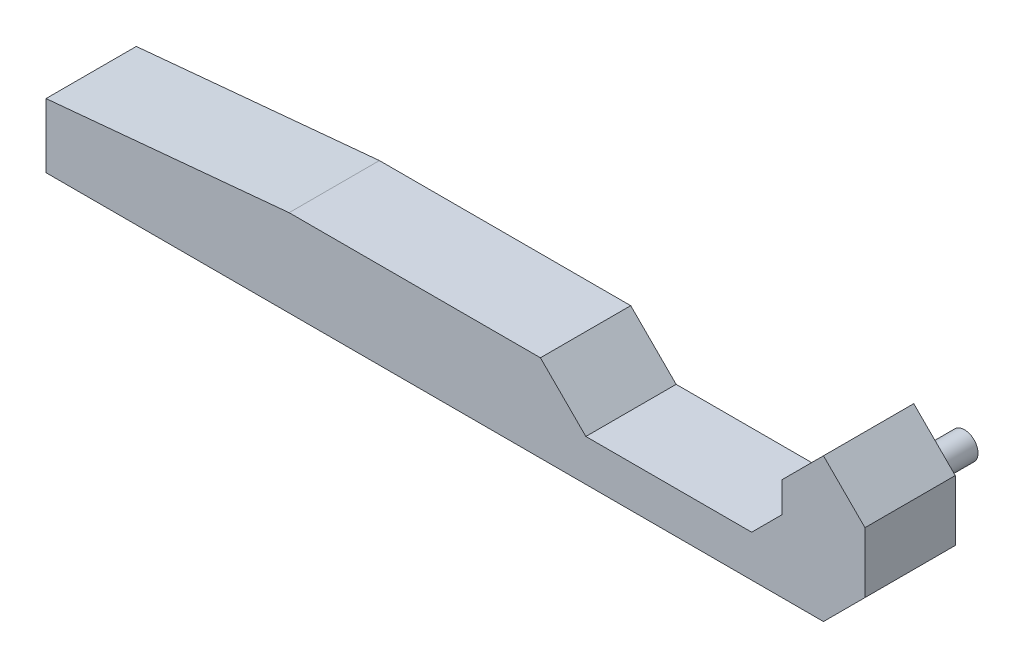
ISO-10303-21;
HEADER;
FILE_DESCRIPTION(('STEP AP214'),'2;1');
FILE_NAME('part.step','',(''),(''),'','','');
FILE_SCHEMA(('AUTOMOTIVE_DESIGN { 1 0 10303 214 1 1 1 1 }'));
ENDSEC;
DATA;
#1=APPLICATION_CONTEXT('core data for automotive mechanical design processes');
#2=APPLICATION_PROTOCOL_DEFINITION('international standard','automotive_design',2000,#1);
#3=PRODUCT_CONTEXT('',#1,'mechanical');
#4=PRODUCT('Part','Part','',(#3));
#5=PRODUCT_RELATED_PRODUCT_CATEGORY('part','',(#4));
#6=PRODUCT_DEFINITION_FORMATION('','',#4);
#7=PRODUCT_DEFINITION_CONTEXT('part definition',#1,'design');
#8=PRODUCT_DEFINITION('design','',#6,#7);
#9=PRODUCT_DEFINITION_SHAPE('','',#8);
#10=(LENGTH_UNIT() NAMED_UNIT(*) SI_UNIT(.MILLI.,.METRE.));
#11=(NAMED_UNIT(*) PLANE_ANGLE_UNIT() SI_UNIT($,.RADIAN.));
#12=(NAMED_UNIT(*) SI_UNIT($,.STERADIAN.) SOLID_ANGLE_UNIT());
#13=UNCERTAINTY_MEASURE_WITH_UNIT(LENGTH_MEASURE(1.E-05),#10,'distance_accuracy_value','');
#14=(GEOMETRIC_REPRESENTATION_CONTEXT(3) GLOBAL_UNCERTAINTY_ASSIGNED_CONTEXT((#13)) GLOBAL_UNIT_ASSIGNED_CONTEXT((#10,
#11,#12)) REPRESENTATION_CONTEXT('',''));
#15=CARTESIAN_POINT('',(0.,0.,0.));
#16=DIRECTION('',(0.,0.,1.));
#17=DIRECTION('',(1.,0.,0.));
#18=AXIS2_PLACEMENT_3D('',#15,#16,#17);
#19=CARTESIAN_POINT('',(0.,0.,10.));
#20=DIRECTION('',(-0.707106781186548,-0.707106781186548,0.));
#21=DIRECTION('',(0.707106781186548,-0.707106781186548,0.));
#22=AXIS2_PLACEMENT_3D('',#19,#20,#21);
#23=PLANE('',#22);
#24=DIRECTION('',(-0.707106781186547,0.707106781186547,0.));
#25=VECTOR('',#24,1.);
#26=CARTESIAN_POINT('',(0.,0.,0.));
#27=LINE('',#26,#25);
#28=CARTESIAN_POINT('',(0.,0.,0.));
#29=VERTEX_POINT('',#28);
#30=CARTESIAN_POINT('',(-4.59728123929288,4.59728123929288,0.));
#31=VERTEX_POINT('',#30);
#32=EDGE_CURVE('E153',#29,#31,#27,.T.);
#33=ORIENTED_EDGE('',*,*,#32,.T.);
#34=DIRECTION('',(0.,0.,-1.));
#35=VECTOR('',#34,1.);
#36=CARTESIAN_POINT('',(-4.59728123929288,4.59728123929288,10.));
#37=LINE('',#36,#35);
#38=CARTESIAN_POINT('',(-4.59728123929288,4.59728123929288,10.));
#39=VERTEX_POINT('',#38);
#40=EDGE_CURVE('E41',#39,#31,#37,.T.);
#41=ORIENTED_EDGE('',*,*,#40,.F.);
#42=DIRECTION('',(-0.707106781186547,0.707106781186547,0.));
#43=VECTOR('',#42,1.);
#44=CARTESIAN_POINT('',(0.,0.,10.));
#45=LINE('',#44,#43);
#46=CARTESIAN_POINT('',(0.,0.,10.));
#47=VERTEX_POINT('',#46);
#48=EDGE_CURVE('E178',#47,#39,#45,.T.);
#49=ORIENTED_EDGE('',*,*,#48,.F.);
#50=DIRECTION('',(0.,0.,-1.));
#51=VECTOR('',#50,1.);
#52=CARTESIAN_POINT('',(0.,0.,10.));
#53=LINE('',#52,#51);
#54=EDGE_CURVE('E149',#47,#29,#53,.T.);
#55=ORIENTED_EDGE('',*,*,#54,.T.);
#56=EDGE_LOOP('',(#33,#41,#49,#55));
#57=FACE_BOUND('',#56,.T.);
#58=ADVANCED_FACE('F33',(#57),#23,.F.);
#59=CARTESIAN_POINT('',(-4.59728123929288,4.59728123929288,10.));
#60=DIRECTION('',(0.707106781186548,-0.707106781186548,0.));
#61=DIRECTION('',(0.707106781186548,0.707106781186548,0.));
#62=AXIS2_PLACEMENT_3D('',#59,#60,#61);
#63=PLANE('',#62);
#64=DIRECTION('',(-0.707106781186547,-0.707106781186547,0.));
#65=VECTOR('',#64,1.);
#66=CARTESIAN_POINT('',(-4.59728123929288,4.59728123929288,0.));
#67=LINE('',#66,#65);
#68=CARTESIAN_POINT('',(-9.19456247858576,0.,0.));
#69=VERTEX_POINT('',#68);
#70=EDGE_CURVE('E156',#31,#69,#67,.T.);
#71=ORIENTED_EDGE('',*,*,#70,.T.);
#72=DIRECTION('',(0.,0.,-1.));
#73=VECTOR('',#72,1.);
#74=CARTESIAN_POINT('',(-9.19456247858576,0.,10.));
#75=LINE('',#74,#73);
#76=CARTESIAN_POINT('',(-9.19456247858576,0.,10.));
#77=VERTEX_POINT('',#76);
#78=EDGE_CURVE('E200',#77,#69,#75,.T.);
#79=ORIENTED_EDGE('',*,*,#78,.F.);
#80=DIRECTION('',(-0.707106781186547,-0.707106781186547,0.));
#81=VECTOR('',#80,1.);
#82=CARTESIAN_POINT('',(-4.59728123929288,4.59728123929288,10.));
#83=LINE('',#82,#81);
#84=EDGE_CURVE('E105',#39,#77,#83,.T.);
#85=ORIENTED_EDGE('',*,*,#84,.F.);
#86=ORIENTED_EDGE('',*,*,#40,.T.);
#87=EDGE_LOOP('',(#71,#79,#85,#86));
#88=FACE_BOUND('',#87,.T.);
#89=ADVANCED_FACE('F203',(#88),#63,.F.);
#90=CARTESIAN_POINT('',(-9.19456247858576,0.,10.));
#91=DIRECTION('',(1.,0.,0.));
#92=DIRECTION('',(0.,0.,-1.));
#93=AXIS2_PLACEMENT_3D('',#90,#91,#92);
#94=PLANE('',#93);
#95=DIRECTION('',(0.,-1.,0.));
#96=VECTOR('',#95,1.);
#97=CARTESIAN_POINT('',(-9.19456247858576,0.,0.));
#98=LINE('',#97,#96);
#99=CARTESIAN_POINT('',(-9.19456247858576,-3.3545956664358,0.));
#100=VERTEX_POINT('',#99);
#101=EDGE_CURVE('E159',#69,#100,#98,.T.);
#102=ORIENTED_EDGE('',*,*,#101,.T.);
#103=DIRECTION('',(0.,0.,-1.));
#104=VECTOR('',#103,1.);
#105=CARTESIAN_POINT('',(-9.19456247858576,-3.3545956664358,10.));
#106=LINE('',#105,#104);
#107=CARTESIAN_POINT('',(-9.19456247858576,-3.3545956664358,10.));
#108=VERTEX_POINT('',#107);
#109=EDGE_CURVE('E197',#108,#100,#106,.T.);
#110=ORIENTED_EDGE('',*,*,#109,.F.);
#111=DIRECTION('',(0.,-1.,0.));
#112=VECTOR('',#111,1.);
#113=CARTESIAN_POINT('',(-9.19456247858576,0.,10.));
#114=LINE('',#113,#112);
#115=EDGE_CURVE('E223',#77,#108,#114,.T.);
#116=ORIENTED_EDGE('',*,*,#115,.F.);
#117=ORIENTED_EDGE('',*,*,#78,.T.);
#118=EDGE_LOOP('',(#102,#110,#116,#117));
#119=FACE_BOUND('',#118,.T.);
#120=ADVANCED_FACE('F214',(#119),#94,.F.);
#121=CARTESIAN_POINT('',(-9.19456247858576,-3.3545956664358,10.));
#122=DIRECTION('',(0.707106781186548,-0.707106781186548,0.));
#123=DIRECTION('',(0.707106781186548,0.707106781186548,0.));
#124=AXIS2_PLACEMENT_3D('',#121,#122,#123);
#125=PLANE('',#124);
#126=DIRECTION('',(-0.707106781186547,-0.707106781186547,0.));
#127=VECTOR('',#126,1.);
#128=CARTESIAN_POINT('',(-9.19456247858576,-3.3545956664358,0.));
#129=LINE('',#128,#127);
#130=CARTESIAN_POINT('',(-12.5491581450216,-6.70919133287159,0.));
#131=VERTEX_POINT('',#130);
#132=EDGE_CURVE('E161',#100,#131,#129,.T.);
#133=ORIENTED_EDGE('',*,*,#132,.T.);
#134=DIRECTION('',(0.,0.,-1.));
#135=VECTOR('',#134,1.);
#136=CARTESIAN_POINT('',(-12.5491581450216,-6.70919133287159,10.));
#137=LINE('',#136,#135);
#138=CARTESIAN_POINT('',(-12.5491581450216,-6.70919133287159,10.));
#139=VERTEX_POINT('',#138);
#140=EDGE_CURVE('E194',#139,#131,#137,.T.);
#141=ORIENTED_EDGE('',*,*,#140,.F.);
#142=DIRECTION('',(-0.707106781186547,-0.707106781186547,0.));
#143=VECTOR('',#142,1.);
#144=CARTESIAN_POINT('',(-9.19456247858576,-3.3545956664358,10.));
#145=LINE('',#144,#143);
#146=EDGE_CURVE('E220',#108,#139,#145,.T.);
#147=ORIENTED_EDGE('',*,*,#146,.F.);
#148=ORIENTED_EDGE('',*,*,#109,.T.);
#149=EDGE_LOOP('',(#133,#141,#147,#148));
#150=FACE_BOUND('',#149,.T.);
#151=ADVANCED_FACE('F218',(#150),#125,.F.);
#152=CARTESIAN_POINT('',(-12.5491581450216,-6.70919133287159,10.));
#153=DIRECTION('',(0.,-1.,0.));
#154=DIRECTION('',(0.,0.,-1.));
#155=AXIS2_PLACEMENT_3D('',#152,#153,#154);
#156=PLANE('',#155);
#157=DIRECTION('',(-1.,0.,0.));
#158=VECTOR('',#157,1.);
#159=CARTESIAN_POINT('',(-12.5491581450216,-6.70919133287159,0.));
#160=LINE('',#159,#158);
#161=CARTESIAN_POINT('',(-30.9135768972688,-6.70919133287159,0.));
#162=VERTEX_POINT('',#161);
#163=EDGE_CURVE('E163',#131,#162,#160,.T.);
#164=ORIENTED_EDGE('',*,*,#163,.T.);
#165=DIRECTION('',(0.,0.,-1.));
#166=VECTOR('',#165,1.);
#167=CARTESIAN_POINT('',(-30.9135768972688,-6.70919133287159,10.));
#168=LINE('',#167,#166);
#169=CARTESIAN_POINT('',(-30.9135768972688,-6.70919133287159,10.));
#170=VERTEX_POINT('',#169);
#171=EDGE_CURVE('E191',#170,#162,#168,.T.);
#172=ORIENTED_EDGE('',*,*,#171,.F.);
#173=DIRECTION('',(-1.,0.,0.));
#174=VECTOR('',#173,1.);
#175=CARTESIAN_POINT('',(-12.5491581450216,-6.70919133287159,10.));
#176=LINE('',#175,#174);
#177=EDGE_CURVE('E222',#139,#170,#176,.T.);
#178=ORIENTED_EDGE('',*,*,#177,.F.);
#179=ORIENTED_EDGE('',*,*,#140,.T.);
#180=EDGE_LOOP('',(#164,#172,#178,#179));
#181=FACE_BOUND('',#180,.T.);
#182=ADVANCED_FACE('F259',(#181),#156,.F.);
#183=CARTESIAN_POINT('',(-30.9135768972688,-6.70919133287159,10.));
#184=DIRECTION('',(-0.707106781186547,-0.707106781186548,0.));
#185=DIRECTION('',(0.707106781186548,-0.707106781186547,0.));
#186=AXIS2_PLACEMENT_3D('',#183,#184,#185);
#187=PLANE('',#186);
#188=DIRECTION('',(-0.707106781186548,0.707106781186547,0.));
#189=VECTOR('',#188,1.);
#190=CARTESIAN_POINT('',(-30.9135768972688,-6.70919133287159,0.));
#191=LINE('',#190,#189);
#192=CARTESIAN_POINT('',(-35.9454703969225,-1.6772978332179,0.));
#193=VERTEX_POINT('',#192);
#194=EDGE_CURVE('E165',#162,#193,#191,.T.);
#195=ORIENTED_EDGE('',*,*,#194,.T.);
#196=DIRECTION('',(0.,0.,-1.));
#197=VECTOR('',#196,1.);
#198=CARTESIAN_POINT('',(-35.9454703969225,-1.6772978332179,10.));
#199=LINE('',#198,#197);
#200=CARTESIAN_POINT('',(-35.9454703969225,-1.6772978332179,10.));
#201=VERTEX_POINT('',#200);
#202=EDGE_CURVE('E188',#201,#193,#199,.T.);
#203=ORIENTED_EDGE('',*,*,#202,.F.);
#204=DIRECTION('',(-0.707106781186548,0.707106781186547,0.));
#205=VECTOR('',#204,1.);
#206=CARTESIAN_POINT('',(-30.9135768972688,-6.70919133287159,10.));
#207=LINE('',#206,#205);
#208=EDGE_CURVE('E225',#170,#201,#207,.T.);
#209=ORIENTED_EDGE('',*,*,#208,.F.);
#210=ORIENTED_EDGE('',*,*,#171,.T.);
#211=EDGE_LOOP('',(#195,#203,#209,#210));
#212=FACE_BOUND('',#211,.T.);
#213=ADVANCED_FACE('F248',(#212),#187,.F.);
#214=CARTESIAN_POINT('',(-49.5884714396916,-1.6772978332179,10.));
#215=DIRECTION('',(0.,-1.,0.));
#216=DIRECTION('',(0.,0.,-1.));
#217=AXIS2_PLACEMENT_3D('',#214,#215,#216);
#218=PLANE('',#217);
#219=DIRECTION('',(-1.,0.,0.));
#220=VECTOR('',#219,1.);
#221=CARTESIAN_POINT('',(-49.5884714396916,-1.6772978332179,0.));
#222=LINE('',#221,#220);
#223=CARTESIAN_POINT('',(-63.7796449400044,-1.6772978332179,0.));
#224=VERTEX_POINT('',#223);
#225=EDGE_CURVE('E168',#193,#224,#222,.T.);
#226=ORIENTED_EDGE('',*,*,#225,.T.);
#227=DIRECTION('',(0.,0.,-1.));
#228=VECTOR('',#227,1.);
#229=CARTESIAN_POINT('',(-63.7796449400044,-1.6772978332179,10.));
#230=LINE('',#229,#228);
#231=CARTESIAN_POINT('',(-63.7796449400044,-1.6772978332179,10.));
#232=VERTEX_POINT('',#231);
#233=EDGE_CURVE('E185',#232,#224,#230,.T.);
#234=ORIENTED_EDGE('',*,*,#233,.F.);
#235=DIRECTION('',(-1.,0.,0.));
#236=VECTOR('',#235,1.);
#237=CARTESIAN_POINT('',(-35.9454703969225,-1.6772978332179,10.));
#238=LINE('',#237,#236);
#239=EDGE_CURVE('E231',#201,#232,#238,.T.);
#240=ORIENTED_EDGE('',*,*,#239,.F.);
#241=ORIENTED_EDGE('',*,*,#202,.T.);
#242=EDGE_LOOP('',(#226,#234,#240,#241));
#243=FACE_BOUND('',#242,.T.);
#244=ADVANCED_FACE('F251',(#243),#218,.F.);
#245=CARTESIAN_POINT('',(-63.7796449400044,-1.6772978332179,10.));
#246=DIRECTION('',(0.0930311687385917,-0.995663196890963,0.));
#247=DIRECTION('',(0.995663196890963,0.0930311687385917,0.));
#248=AXIS2_PLACEMENT_3D('',#245,#246,#247);
#249=PLANE('',#248);
#250=DIRECTION('',(-0.995663196890963,-0.0930311687385917,0.));
#251=VECTOR('',#250,1.);
#252=CARTESIAN_POINT('',(-63.7796449400044,-1.6772978332179,0.));
#253=LINE('',#252,#251);
#254=CARTESIAN_POINT('',(-90.7064869662389,-4.19324458304475,0.));
#255=VERTEX_POINT('',#254);
#256=EDGE_CURVE('E170',#224,#255,#253,.T.);
#257=ORIENTED_EDGE('',*,*,#256,.T.);
#258=DIRECTION('',(0.,0.,-1.));
#259=VECTOR('',#258,1.);
#260=CARTESIAN_POINT('',(-90.7064869662389,-4.19324458304475,10.));
#261=LINE('',#260,#259);
#262=CARTESIAN_POINT('',(-90.7064869662389,-4.19324458304475,10.));
#263=VERTEX_POINT('',#262);
#264=EDGE_CURVE('E182',#263,#255,#261,.T.);
#265=ORIENTED_EDGE('',*,*,#264,.F.);
#266=DIRECTION('',(-0.995663196890963,-0.0930311687385917,0.));
#267=VECTOR('',#266,1.);
#268=CARTESIAN_POINT('',(-63.7796449400044,-1.6772978332179,10.));
#269=LINE('',#268,#267);
#270=EDGE_CURVE('E233',#232,#263,#269,.T.);
#271=ORIENTED_EDGE('',*,*,#270,.F.);
#272=ORIENTED_EDGE('',*,*,#233,.T.);
#273=EDGE_LOOP('',(#257,#265,#271,#272));
#274=FACE_BOUND('',#273,.T.);
#275=ADVANCED_FACE('F239',(#274),#249,.F.);
#276=CARTESIAN_POINT('',(-90.7064869662389,-11.3064725721645,10.));
#277=DIRECTION('',(1.,0.,0.));
#278=DIRECTION('',(0.,0.,-1.));
#279=AXIS2_PLACEMENT_3D('',#276,#277,#278);
#280=PLANE('',#279);
#281=DIRECTION('',(0.,-1.,0.));
#282=VECTOR('',#281,1.);
#283=CARTESIAN_POINT('',(-90.7064869662389,-11.3064725721645,0.));
#284=LINE('',#283,#282);
#285=CARTESIAN_POINT('',(-90.7064869662389,-11.3064725721645,0.));
#286=VERTEX_POINT('',#285);
#287=EDGE_CURVE('E172',#255,#286,#284,.T.);
#288=ORIENTED_EDGE('',*,*,#287,.T.);
#289=DIRECTION('',(0.,0.,-1.));
#290=VECTOR('',#289,1.);
#291=CARTESIAN_POINT('',(-90.7064869662389,-11.3064725721645,10.));
#292=LINE('',#291,#290);
#293=CARTESIAN_POINT('',(-90.7064869662389,-11.3064725721645,10.));
#294=VERTEX_POINT('',#293);
#295=EDGE_CURVE('E144',#294,#286,#292,.T.);
#296=ORIENTED_EDGE('',*,*,#295,.F.);
#297=DIRECTION('',(0.,-1.,0.));
#298=VECTOR('',#297,1.);
#299=CARTESIAN_POINT('',(-90.7064869662389,-11.3064725721645,10.));
#300=LINE('',#299,#298);
#301=EDGE_CURVE('E136',#263,#294,#300,.T.);
#302=ORIENTED_EDGE('',*,*,#301,.F.);
#303=ORIENTED_EDGE('',*,*,#264,.T.);
#304=EDGE_LOOP('',(#288,#296,#302,#303));
#305=FACE_BOUND('',#304,.T.);
#306=ADVANCED_FACE('F243',(#305),#280,.F.);
#307=CARTESIAN_POINT('',(-4.59728123929288,-11.3064725721645,10.));
#308=DIRECTION('',(0.,1.,0.));
#309=DIRECTION('',(0.,0.,1.));
#310=AXIS2_PLACEMENT_3D('',#307,#308,#309);
#311=PLANE('',#310);
#312=DIRECTION('',(1.,0.,0.));
#313=VECTOR('',#312,1.);
#314=CARTESIAN_POINT('',(-4.59728123929288,-11.3064725721645,0.));
#315=LINE('',#314,#313);
#316=CARTESIAN_POINT('',(-4.59728123929288,-11.3064725721645,0.));
#317=VERTEX_POINT('',#316);
#318=EDGE_CURVE('E143',#286,#317,#315,.T.);
#319=ORIENTED_EDGE('',*,*,#318,.T.);
#320=DIRECTION('',(0.,0.,-1.));
#321=VECTOR('',#320,1.);
#322=CARTESIAN_POINT('',(-4.59728123929288,-11.3064725721645,10.));
#323=LINE('',#322,#321);
#324=CARTESIAN_POINT('',(-4.59728123929288,-11.3064725721645,10.));
#325=VERTEX_POINT('',#324);
#326=EDGE_CURVE('E141',#325,#317,#323,.T.);
#327=ORIENTED_EDGE('',*,*,#326,.F.);
#328=DIRECTION('',(1.,0.,0.));
#329=VECTOR('',#328,1.);
#330=CARTESIAN_POINT('',(-83.7928383378814,-11.3064725721645,10.));
#331=LINE('',#330,#329);
#332=EDGE_CURVE('E130',#294,#325,#331,.T.);
#333=ORIENTED_EDGE('',*,*,#332,.F.);
#334=ORIENTED_EDGE('',*,*,#295,.T.);
#335=EDGE_LOOP('',(#319,#327,#333,#334));
#336=FACE_BOUND('',#335,.T.);
#337=ADVANCED_FACE('F142',(#336),#311,.F.);
#338=CARTESIAN_POINT('',(0.,-6.70919133287159,10.));
#339=DIRECTION('',(-0.707106781186548,0.707106781186548,0.));
#340=DIRECTION('',(-0.707106781186548,-0.707106781186548,0.));
#341=AXIS2_PLACEMENT_3D('',#338,#339,#340);
#342=PLANE('',#341);
#343=DIRECTION('',(0.707106781186547,0.707106781186547,0.));
#344=VECTOR('',#343,1.);
#345=CARTESIAN_POINT('',(0.,-6.70919133287159,0.));
#346=LINE('',#345,#344);
#347=CARTESIAN_POINT('',(0.,-6.70919133287159,0.));
#348=VERTEX_POINT('',#347);
#349=EDGE_CURVE('E90',#317,#348,#346,.T.);
#350=ORIENTED_EDGE('',*,*,#349,.T.);
#351=DIRECTION('',(0.,0.,-1.));
#352=VECTOR('',#351,1.);
#353=CARTESIAN_POINT('',(0.,-6.70919133287159,10.));
#354=LINE('',#353,#352);
#355=CARTESIAN_POINT('',(0.,-6.70919133287159,10.));
#356=VERTEX_POINT('',#355);
#357=EDGE_CURVE('E145',#356,#348,#354,.T.);
#358=ORIENTED_EDGE('',*,*,#357,.F.);
#359=DIRECTION('',(0.707106781186547,0.707106781186547,0.));
#360=VECTOR('',#359,1.);
#361=CARTESIAN_POINT('',(0.,-6.70919133287159,10.));
#362=LINE('',#361,#360);
#363=EDGE_CURVE('E134',#325,#356,#362,.T.);
#364=ORIENTED_EDGE('',*,*,#363,.F.);
#365=ORIENTED_EDGE('',*,*,#326,.T.);
#366=EDGE_LOOP('',(#350,#358,#364,#365));
#367=FACE_BOUND('',#366,.T.);
#368=ADVANCED_FACE('F147',(#367),#342,.F.);
#369=CARTESIAN_POINT('',(0.,0.,10.));
#370=DIRECTION('',(-1.,0.,0.));
#371=DIRECTION('',(0.,0.,1.));
#372=AXIS2_PLACEMENT_3D('',#369,#370,#371);
#373=PLANE('',#372);
#374=DIRECTION('',(0.,1.,0.));
#375=VECTOR('',#374,1.);
#376=CARTESIAN_POINT('',(0.,0.,0.));
#377=LINE('',#376,#375);
#378=EDGE_CURVE('E96',#348,#29,#377,.T.);
#379=ORIENTED_EDGE('',*,*,#378,.T.);
#380=ORIENTED_EDGE('',*,*,#54,.F.);
#381=DIRECTION('',(0.,1.,0.));
#382=VECTOR('',#381,1.);
#383=CARTESIAN_POINT('',(0.,0.,10.));
#384=LINE('',#383,#382);
#385=EDGE_CURVE('E49',#356,#47,#384,.T.);
#386=ORIENTED_EDGE('',*,*,#385,.F.);
#387=ORIENTED_EDGE('',*,*,#357,.T.);
#388=EDGE_LOOP('',(#379,#380,#386,#387));
#389=FACE_BOUND('',#388,.T.);
#390=ADVANCED_FACE('F320',(#389),#373,.F.);
#391=CARTESIAN_POINT('',(0.,0.,10.));
#392=DIRECTION('',(0.,0.,1.));
#393=DIRECTION('',(1.,0.,0.));
#394=AXIS2_PLACEMENT_3D('',#391,#392,#393);
#395=PLANE('',#394);
#396=ORIENTED_EDGE('',*,*,#48,.T.);
#397=ORIENTED_EDGE('',*,*,#84,.T.);
#398=ORIENTED_EDGE('',*,*,#115,.T.);
#399=ORIENTED_EDGE('',*,*,#146,.T.);
#400=ORIENTED_EDGE('',*,*,#177,.T.);
#401=ORIENTED_EDGE('',*,*,#208,.T.);
#402=ORIENTED_EDGE('',*,*,#239,.T.);
#403=ORIENTED_EDGE('',*,*,#270,.T.);
#404=ORIENTED_EDGE('',*,*,#301,.T.);
#405=ORIENTED_EDGE('',*,*,#332,.T.);
#406=ORIENTED_EDGE('',*,*,#363,.T.);
#407=ORIENTED_EDGE('',*,*,#385,.T.);
#408=EDGE_LOOP('',(#396,#397,#398,#399,#400,#401,#402,#403,#404,#405,#406,#407));
#409=FACE_BOUND('',#408,.T.);
#410=ADVANCED_FACE('F132',(#409),#395,.T.);
#411=CARTESIAN_POINT('',(0.,0.,0.));
#412=DIRECTION('',(0.,0.,1.));
#413=DIRECTION('',(1.,0.,0.));
#414=AXIS2_PLACEMENT_3D('',#411,#412,#413);
#415=PLANE('',#414);
#416=CARTESIAN_POINT('',(-3.98147987144373,-1.59144459528233,0.));
#417=DIRECTION('',(0.,0.,1.));
#418=DIRECTION('',(1.,0.,0.));
#419=AXIS2_PLACEMENT_3D('',#416,#417,#418);
#420=CIRCLE('',#419,1.5);
#421=CARTESIAN_POINT('',(-2.48147987144373,-1.59144459528233,0.));
#422=VERTEX_POINT('',#421);
#423=EDGE_CURVE('E11',#422,#422,#420,.F.);
#424=ORIENTED_EDGE('',*,*,#423,.F.);
#425=EDGE_LOOP('',(#424));
#426=FACE_BOUND('',#425,.T.);
#427=ORIENTED_EDGE('',*,*,#32,.F.);
#428=ORIENTED_EDGE('',*,*,#378,.F.);
#429=ORIENTED_EDGE('',*,*,#349,.F.);
#430=ORIENTED_EDGE('',*,*,#318,.F.);
#431=ORIENTED_EDGE('',*,*,#287,.F.);
#432=ORIENTED_EDGE('',*,*,#256,.F.);
#433=ORIENTED_EDGE('',*,*,#225,.F.);
#434=ORIENTED_EDGE('',*,*,#194,.F.);
#435=ORIENTED_EDGE('',*,*,#163,.F.);
#436=ORIENTED_EDGE('',*,*,#132,.F.);
#437=ORIENTED_EDGE('',*,*,#101,.F.);
#438=ORIENTED_EDGE('',*,*,#70,.F.);
#439=EDGE_LOOP('',(#427,#428,#429,#430,#431,#432,#433,#434,#435,#436,#437,#438));
#440=FACE_BOUND('',#439,.T.);
#441=ADVANCED_FACE('F208',(#426,#440),#415,.F.);
#442=CARTESIAN_POINT('',(-3.98147987144373,-1.59144459528233,-5.));
#443=DIRECTION('',(0.,0.,1.));
#444=DIRECTION('',(1.,0.,0.));
#445=AXIS2_PLACEMENT_3D('',#442,#443,#444);
#446=CYLINDRICAL_SURFACE('',#445,1.5);
#447=CARTESIAN_POINT('',(-3.98147987144373,-1.59144459528233,-5.));
#448=DIRECTION('',(0.,0.,-1.));
#449=DIRECTION('',(-1.,0.,0.));
#450=AXIS2_PLACEMENT_3D('',#447,#448,#449);
#451=CIRCLE('',#450,1.5);
#452=CARTESIAN_POINT('',(-5.48147987144373,-1.59144459528233,-5.));
#453=VERTEX_POINT('',#452);
#454=EDGE_CURVE('E157',#453,#453,#451,.T.);
#455=ORIENTED_EDGE('',*,*,#454,.F.);
#456=EDGE_LOOP('',(#455));
#457=FACE_BOUND('',#456,.T.);
#458=ORIENTED_EDGE('',*,*,#423,.T.);
#459=EDGE_LOOP('',(#458));
#460=FACE_BOUND('',#459,.T.);
#461=ADVANCED_FACE('F345',(#457,#460),#446,.T.);
#462=CARTESIAN_POINT('',(-3.98147987144373,-1.59144459528233,-5.));
#463=DIRECTION('',(0.,0.,-1.));
#464=DIRECTION('',(-1.,0.,0.));
#465=AXIS2_PLACEMENT_3D('',#462,#463,#464);
#466=PLANE('',#465);
#467=ORIENTED_EDGE('',*,*,#454,.T.);
#468=EDGE_LOOP('',(#467));
#469=FACE_BOUND('',#468,.T.);
#470=ADVANCED_FACE('F355',(#469),#466,.T.);
#471=CLOSED_SHELL('',(#58,#89,#120,#151,#182,#213,#244,#275,#306,#337,#368,#390,#410,#441,#461,#470));
#472=MANIFOLD_SOLID_BREP('B2',#471);
#473=ADVANCED_BREP_SHAPE_REPRESENTATION('',(#18,#472),#14);
#474=SHAPE_DEFINITION_REPRESENTATION(#9,#473);
ENDSEC;
END-ISO-10303-21;
